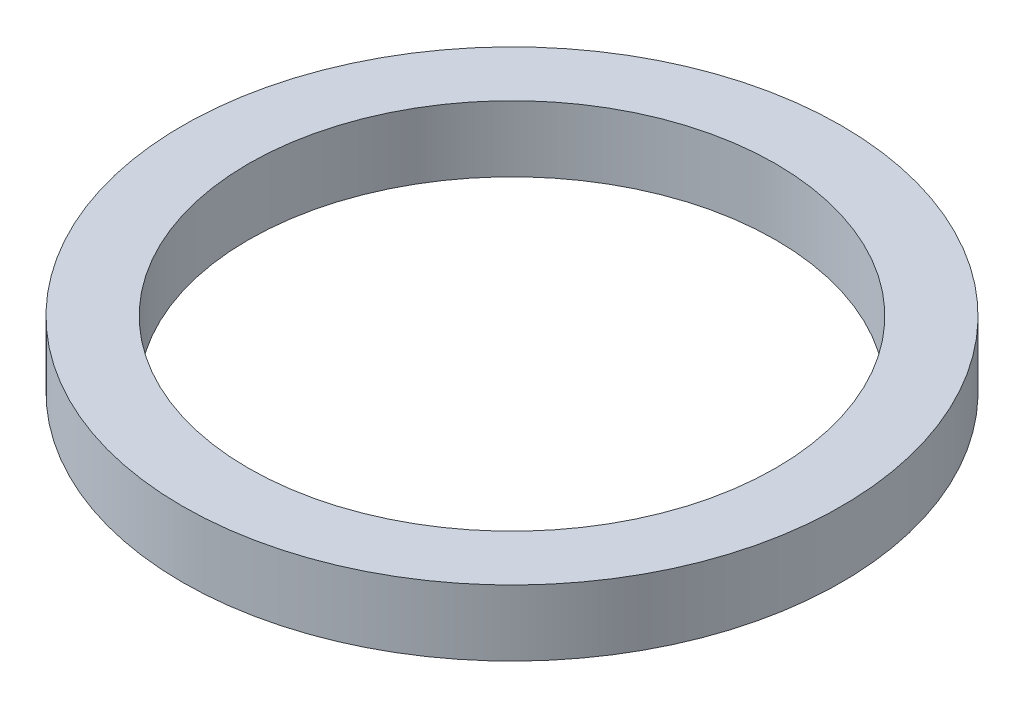
ISO-10303-21;
HEADER;
FILE_DESCRIPTION(('STEP AP214'),'2;1');
FILE_NAME('part.step','',(''),(''),'','','');
FILE_SCHEMA(('AUTOMOTIVE_DESIGN { 1 0 10303 214 1 1 1 1 }'));
ENDSEC;
DATA;
#1=APPLICATION_CONTEXT('core data for automotive mechanical design processes');
#2=APPLICATION_PROTOCOL_DEFINITION('international standard','automotive_design',2000,#1);
#3=PRODUCT_CONTEXT('',#1,'mechanical');
#4=PRODUCT('Part','Part','',(#3));
#5=PRODUCT_RELATED_PRODUCT_CATEGORY('part','',(#4));
#6=PRODUCT_DEFINITION_FORMATION('','',#4);
#7=PRODUCT_DEFINITION_CONTEXT('part definition',#1,'design');
#8=PRODUCT_DEFINITION('design','',#6,#7);
#9=PRODUCT_DEFINITION_SHAPE('','',#8);
#10=(LENGTH_UNIT() NAMED_UNIT(*) SI_UNIT(.MILLI.,.METRE.));
#11=(NAMED_UNIT(*) PLANE_ANGLE_UNIT() SI_UNIT($,.RADIAN.));
#12=(NAMED_UNIT(*) SI_UNIT($,.STERADIAN.) SOLID_ANGLE_UNIT());
#13=UNCERTAINTY_MEASURE_WITH_UNIT(LENGTH_MEASURE(1.E-05),#10,'distance_accuracy_value','');
#14=(GEOMETRIC_REPRESENTATION_CONTEXT(3) GLOBAL_UNCERTAINTY_ASSIGNED_CONTEXT((#13)) GLOBAL_UNIT_ASSIGNED_CONTEXT((#10,
#11,#12)) REPRESENTATION_CONTEXT('',''));
#15=CARTESIAN_POINT('',(0.,0.,0.));
#16=DIRECTION('',(0.,0.,1.));
#17=DIRECTION('',(1.,0.,0.));
#18=AXIS2_PLACEMENT_3D('',#15,#16,#17);
#19=CARTESIAN_POINT('',(0.,10.,0.));
#20=DIRECTION('',(0.,1.,0.));
#21=DIRECTION('',(0.,0.,1.));
#22=AXIS2_PLACEMENT_3D('',#19,#20,#21);
#23=PLANE('',#22);
#24=CARTESIAN_POINT('',(0.,10.,0.));
#25=DIRECTION('',(0.,1.,0.));
#26=DIRECTION('',(0.,0.,1.));
#27=AXIS2_PLACEMENT_3D('',#24,#25,#26);
#28=CIRCLE('',#27,50.);
#29=CARTESIAN_POINT('',(0.,10.,50.));
#30=VERTEX_POINT('',#29);
#31=EDGE_CURVE('E10',#30,#30,#28,.T.);
#32=ORIENTED_EDGE('',*,*,#31,.T.);
#33=EDGE_LOOP('',(#32));
#34=FACE_BOUND('',#33,.T.);
#35=CARTESIAN_POINT('',(0.,10.,0.));
#36=DIRECTION('',(0.,1.,0.));
#37=DIRECTION('',(0.,0.,1.));
#38=AXIS2_PLACEMENT_3D('',#35,#36,#37);
#39=CIRCLE('',#38,40.);
#40=CARTESIAN_POINT('',(0.,10.,40.));
#41=VERTEX_POINT('',#40);
#42=EDGE_CURVE('E44',#41,#41,#39,.T.);
#43=ORIENTED_EDGE('',*,*,#42,.F.);
#44=EDGE_LOOP('',(#43));
#45=FACE_BOUND('',#44,.T.);
#46=ADVANCED_FACE('F33',(#34,#45),#23,.T.);
#47=CARTESIAN_POINT('',(0.,0.,0.));
#48=DIRECTION('',(0.,1.,0.));
#49=DIRECTION('',(0.,0.,1.));
#50=AXIS2_PLACEMENT_3D('',#47,#48,#49);
#51=PLANE('',#50);
#52=CARTESIAN_POINT('',(0.,0.,0.));
#53=DIRECTION('',(0.,1.,0.));
#54=DIRECTION('',(0.,0.,1.));
#55=AXIS2_PLACEMENT_3D('',#52,#53,#54);
#56=CIRCLE('',#55,50.);
#57=CARTESIAN_POINT('',(0.,0.,50.));
#58=VERTEX_POINT('',#57);
#59=EDGE_CURVE('E37',#58,#58,#56,.T.);
#60=ORIENTED_EDGE('',*,*,#59,.F.);
#61=EDGE_LOOP('',(#60));
#62=FACE_BOUND('',#61,.T.);
#63=CARTESIAN_POINT('',(0.,0.,0.));
#64=DIRECTION('',(0.,1.,0.));
#65=DIRECTION('',(0.,0.,1.));
#66=AXIS2_PLACEMENT_3D('',#63,#64,#65);
#67=CIRCLE('',#66,40.);
#68=CARTESIAN_POINT('',(0.,0.,40.));
#69=VERTEX_POINT('',#68);
#70=EDGE_CURVE('E46',#69,#69,#67,.T.);
#71=ORIENTED_EDGE('',*,*,#70,.T.);
#72=EDGE_LOOP('',(#71));
#73=FACE_BOUND('',#72,.T.);
#74=ADVANCED_FACE('F56',(#62,#73),#51,.F.);
#75=CARTESIAN_POINT('',(0.,10.,0.));
#76=DIRECTION('',(0.,-1.,0.));
#77=DIRECTION('',(0.,0.,-1.));
#78=AXIS2_PLACEMENT_3D('',#75,#76,#77);
#79=CYLINDRICAL_SURFACE('',#78,50.);
#80=ORIENTED_EDGE('',*,*,#31,.F.);
#81=EDGE_LOOP('',(#80));
#82=FACE_BOUND('',#81,.T.);
#83=ORIENTED_EDGE('',*,*,#59,.T.);
#84=EDGE_LOOP('',(#83));
#85=FACE_BOUND('',#84,.T.);
#86=ADVANCED_FACE('F35',(#82,#85),#79,.T.);
#87=CARTESIAN_POINT('',(0.,10.,0.));
#88=DIRECTION('',(0.,-1.,0.));
#89=DIRECTION('',(0.,0.,-1.));
#90=AXIS2_PLACEMENT_3D('',#87,#88,#89);
#91=CYLINDRICAL_SURFACE('',#90,40.);
#92=ORIENTED_EDGE('',*,*,#42,.T.);
#93=EDGE_LOOP('',(#92));
#94=FACE_BOUND('',#93,.T.);
#95=ORIENTED_EDGE('',*,*,#70,.F.);
#96=EDGE_LOOP('',(#95));
#97=FACE_BOUND('',#96,.T.);
#98=ADVANCED_FACE('F52',(#94,#97),#91,.F.);
#99=CLOSED_SHELL('',(#46,#74,#86,#98));
#100=MANIFOLD_SOLID_BREP('B2',#99);
#101=ADVANCED_BREP_SHAPE_REPRESENTATION('',(#18,#100),#14);
#102=SHAPE_DEFINITION_REPRESENTATION(#9,#101);
ENDSEC;
END-ISO-10303-21;
